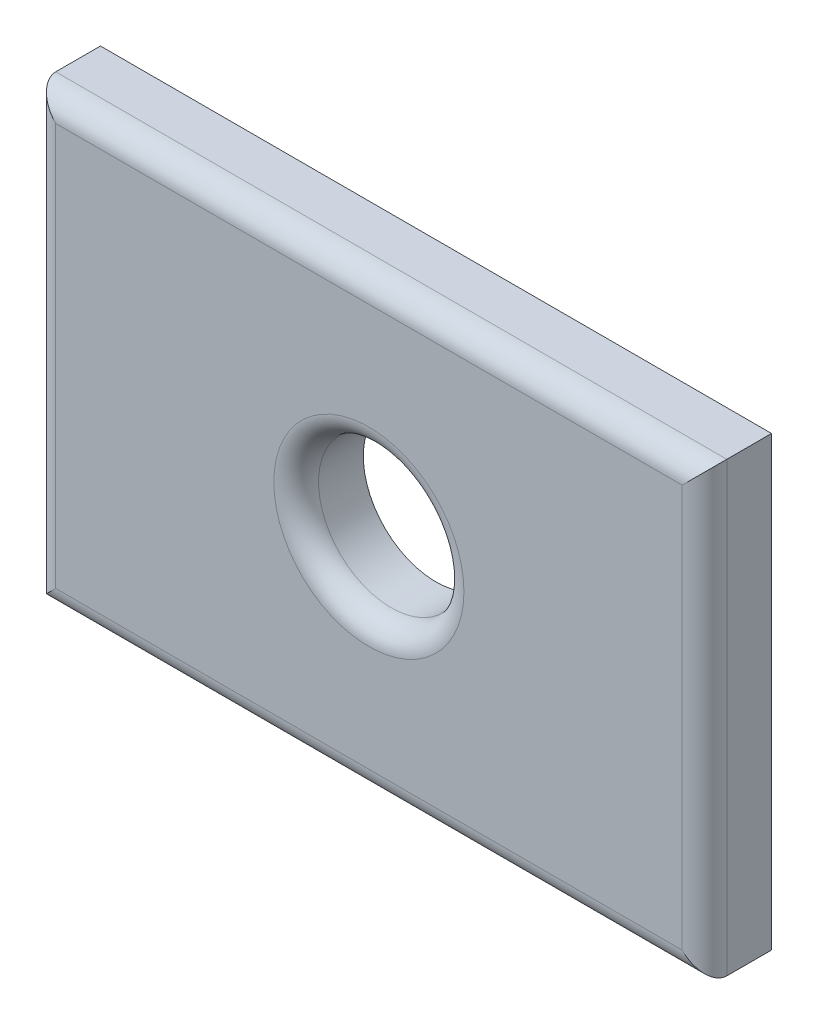
ISO-10303-21;
HEADER;
FILE_DESCRIPTION(('STEP AP214'),'2;1');
FILE_NAME('part.step','',(''),(''),'','','');
FILE_SCHEMA(('AUTOMOTIVE_DESIGN { 1 0 10303 214 1 1 1 1 }'));
ENDSEC;
DATA;
#1=APPLICATION_CONTEXT('core data for automotive mechanical design processes');
#2=APPLICATION_PROTOCOL_DEFINITION('international standard','automotive_design',2000,#1);
#3=PRODUCT_CONTEXT('',#1,'mechanical');
#4=PRODUCT('Part','Part','',(#3));
#5=PRODUCT_RELATED_PRODUCT_CATEGORY('part','',(#4));
#6=PRODUCT_DEFINITION_FORMATION('','',#4);
#7=PRODUCT_DEFINITION_CONTEXT('part definition',#1,'design');
#8=PRODUCT_DEFINITION('design','',#6,#7);
#9=PRODUCT_DEFINITION_SHAPE('','',#8);
#10=(LENGTH_UNIT() NAMED_UNIT(*) SI_UNIT(.MILLI.,.METRE.));
#11=(NAMED_UNIT(*) PLANE_ANGLE_UNIT() SI_UNIT($,.RADIAN.));
#12=(NAMED_UNIT(*) SI_UNIT($,.STERADIAN.) SOLID_ANGLE_UNIT());
#13=UNCERTAINTY_MEASURE_WITH_UNIT(LENGTH_MEASURE(1.E-05),#10,'distance_accuracy_value','');
#14=(GEOMETRIC_REPRESENTATION_CONTEXT(3) GLOBAL_UNCERTAINTY_ASSIGNED_CONTEXT((#13)) GLOBAL_UNIT_ASSIGNED_CONTEXT((#10,
#11,#12)) REPRESENTATION_CONTEXT('',''));
#15=CARTESIAN_POINT('',(0.,0.,0.));
#16=DIRECTION('',(0.,0.,1.));
#17=DIRECTION('',(1.,0.,0.));
#18=AXIS2_PLACEMENT_3D('',#15,#16,#17);
#19=CARTESIAN_POINT('',(-20.0778282304494,9.02612826603326,3.));
#20=DIRECTION('',(1.,0.,0.));
#21=DIRECTION('',(0.,0.,-1.));
#22=AXIS2_PLACEMENT_3D('',#19,#20,#21);
#23=PLANE('',#22);
#24=DIRECTION('',(0.,0.,-1.));
#25=VECTOR('',#24,1.);
#26=CARTESIAN_POINT('',(-20.0778282304494,-10.9738717339667,3.));
#27=LINE('',#26,#25);
#28=CARTESIAN_POINT('',(-20.0778282304494,-10.9738717339667,2.));
#29=VERTEX_POINT('',#28);
#30=CARTESIAN_POINT('',(-20.0778282304494,-10.9738717339667,0.));
#31=VERTEX_POINT('',#30);
#32=EDGE_CURVE('E86',#29,#31,#27,.T.);
#33=ORIENTED_EDGE('',*,*,#32,.F.);
#34=DIRECTION('',(0.,-1.,0.));
#35=VECTOR('',#34,1.);
#36=CARTESIAN_POINT('',(-20.0778282304494,9.02612826603326,2.));
#37=LINE('',#36,#35);
#38=CARTESIAN_POINT('',(-20.0778282304494,9.02612826603326,2.));
#39=VERTEX_POINT('',#38);
#40=EDGE_CURVE('E41',#29,#39,#37,.F.);
#41=ORIENTED_EDGE('',*,*,#40,.T.);
#42=DIRECTION('',(0.,0.,-1.));
#43=VECTOR('',#42,1.);
#44=CARTESIAN_POINT('',(-20.0778282304494,9.02612826603326,3.));
#45=LINE('',#44,#43);
#46=CARTESIAN_POINT('',(-20.0778282304494,9.02612826603326,0.));
#47=VERTEX_POINT('',#46);
#48=EDGE_CURVE('E106',#39,#47,#45,.T.);
#49=ORIENTED_EDGE('',*,*,#48,.T.);
#50=DIRECTION('',(0.,-1.,0.));
#51=VECTOR('',#50,1.);
#52=CARTESIAN_POINT('',(-20.0778282304494,9.02612826603326,0.));
#53=LINE('',#52,#51);
#54=EDGE_CURVE('E101',#47,#31,#53,.T.);
#55=ORIENTED_EDGE('',*,*,#54,.T.);
#56=EDGE_LOOP('',(#33,#41,#49,#55));
#57=FACE_BOUND('',#56,.T.);
#58=ADVANCED_FACE('F32',(#57),#23,.F.);
#59=CARTESIAN_POINT('',(-20.0778282304494,-10.9738717339667,3.));
#60=DIRECTION('',(0.,1.,0.));
#61=DIRECTION('',(0.,0.,1.));
#62=AXIS2_PLACEMENT_3D('',#59,#60,#61);
#63=PLANE('',#62);
#64=DIRECTION('',(0.,0.,-1.));
#65=VECTOR('',#64,1.);
#66=CARTESIAN_POINT('',(9.92217176955057,-10.9738717339667,3.));
#67=LINE('',#66,#65);
#68=CARTESIAN_POINT('',(9.92217176955057,-10.9738717339667,2.));
#69=VERTEX_POINT('',#68);
#70=CARTESIAN_POINT('',(9.92217176955057,-10.9738717339667,0.));
#71=VERTEX_POINT('',#70);
#72=EDGE_CURVE('E95',#69,#71,#67,.T.);
#73=ORIENTED_EDGE('',*,*,#72,.F.);
#74=DIRECTION('',(1.,0.,0.));
#75=VECTOR('',#74,1.);
#76=CARTESIAN_POINT('',(-20.0778282304494,-10.9738717339667,2.));
#77=LINE('',#76,#75);
#78=EDGE_CURVE('E49',#69,#29,#77,.F.);
#79=ORIENTED_EDGE('',*,*,#78,.T.);
#80=ORIENTED_EDGE('',*,*,#32,.T.);
#81=DIRECTION('',(1.,0.,0.));
#82=VECTOR('',#81,1.);
#83=CARTESIAN_POINT('',(-20.0778282304494,-10.9738717339667,0.));
#84=LINE('',#83,#82);
#85=EDGE_CURVE('E89',#31,#71,#84,.T.);
#86=ORIENTED_EDGE('',*,*,#85,.T.);
#87=EDGE_LOOP('',(#73,#79,#80,#86));
#88=FACE_BOUND('',#87,.T.);
#89=ADVANCED_FACE('F88',(#88),#63,.F.);
#90=CARTESIAN_POINT('',(9.92217176955057,9.02612826603326,3.));
#91=DIRECTION('',(-1.,0.,0.));
#92=DIRECTION('',(0.,0.,1.));
#93=AXIS2_PLACEMENT_3D('',#90,#91,#92);
#94=PLANE('',#93);
#95=DIRECTION('',(0.,0.,-1.));
#96=VECTOR('',#95,1.);
#97=CARTESIAN_POINT('',(9.92217176955057,9.02612826603326,3.));
#98=LINE('',#97,#96);
#99=CARTESIAN_POINT('',(9.92217176955057,9.02612826603326,2.));
#100=VERTEX_POINT('',#99);
#101=CARTESIAN_POINT('',(9.92217176955057,9.02612826603326,0.));
#102=VERTEX_POINT('',#101);
#103=EDGE_CURVE('E117',#100,#102,#98,.T.);
#104=ORIENTED_EDGE('',*,*,#103,.F.);
#105=DIRECTION('',(0.,1.,0.));
#106=VECTOR('',#105,1.);
#107=CARTESIAN_POINT('',(9.92217176955057,-10.9738717339667,2.));
#108=LINE('',#107,#106);
#109=EDGE_CURVE('E57',#100,#69,#108,.F.);
#110=ORIENTED_EDGE('',*,*,#109,.T.);
#111=ORIENTED_EDGE('',*,*,#72,.T.);
#112=DIRECTION('',(0.,1.,0.));
#113=VECTOR('',#112,1.);
#114=CARTESIAN_POINT('',(9.92217176955057,9.02612826603326,0.));
#115=LINE('',#114,#113);
#116=EDGE_CURVE('E103',#71,#102,#115,.T.);
#117=ORIENTED_EDGE('',*,*,#116,.T.);
#118=EDGE_LOOP('',(#104,#110,#111,#117));
#119=FACE_BOUND('',#118,.T.);
#120=ADVANCED_FACE('F189',(#119),#94,.F.);
#121=CARTESIAN_POINT('',(-20.0778282304494,9.02612826603326,3.));
#122=DIRECTION('',(0.,-1.,0.));
#123=DIRECTION('',(0.,0.,-1.));
#124=AXIS2_PLACEMENT_3D('',#121,#122,#123);
#125=PLANE('',#124);
#126=ORIENTED_EDGE('',*,*,#48,.F.);
#127=DIRECTION('',(-1.,0.,0.));
#128=VECTOR('',#127,1.);
#129=CARTESIAN_POINT('',(9.92217176955057,9.02612826603326,2.));
#130=LINE('',#129,#128);
#131=EDGE_CURVE('E131',#39,#100,#130,.F.);
#132=ORIENTED_EDGE('',*,*,#131,.T.);
#133=ORIENTED_EDGE('',*,*,#103,.T.);
#134=DIRECTION('',(-1.,0.,0.));
#135=VECTOR('',#134,1.);
#136=CARTESIAN_POINT('',(-20.0778282304494,9.02612826603326,0.));
#137=LINE('',#136,#135);
#138=EDGE_CURVE('E114',#102,#47,#137,.T.);
#139=ORIENTED_EDGE('',*,*,#138,.T.);
#140=EDGE_LOOP('',(#126,#132,#133,#139));
#141=FACE_BOUND('',#140,.T.);
#142=ADVANCED_FACE('F158',(#141),#125,.F.);
#143=CARTESIAN_POINT('',(0.,0.,3.));
#144=DIRECTION('',(0.,0.,1.));
#145=DIRECTION('',(1.,0.,0.));
#146=AXIS2_PLACEMENT_3D('',#143,#144,#145);
#147=PLANE('',#146);
#148=DIRECTION('',(0.,1.,0.));
#149=VECTOR('',#148,1.);
#150=CARTESIAN_POINT('',(8.92217176955057,9.02612826603326,3.));
#151=LINE('',#150,#149);
#152=CARTESIAN_POINT('',(8.92217176955057,-9.97387173396674,3.));
#153=VERTEX_POINT('',#152);
#154=CARTESIAN_POINT('',(8.92217176955057,8.02612826603325,3.));
#155=VERTEX_POINT('',#154);
#156=EDGE_CURVE('E126',#153,#155,#151,.T.);
#157=ORIENTED_EDGE('',*,*,#156,.T.);
#158=DIRECTION('',(-1.,0.,0.));
#159=VECTOR('',#158,1.);
#160=CARTESIAN_POINT('',(-20.0778282304494,8.02612826603325,3.));
#161=LINE('',#160,#159);
#162=CARTESIAN_POINT('',(-19.0778282304494,8.02612826603325,3.));
#163=VERTEX_POINT('',#162);
#164=EDGE_CURVE('E128',#155,#163,#161,.T.);
#165=ORIENTED_EDGE('',*,*,#164,.T.);
#166=DIRECTION('',(0.,-1.,0.));
#167=VECTOR('',#166,1.);
#168=CARTESIAN_POINT('',(-19.0778282304494,-10.9738717339667,3.));
#169=LINE('',#168,#167);
#170=CARTESIAN_POINT('',(-19.0778282304494,-9.97387173396674,3.));
#171=VERTEX_POINT('',#170);
#172=EDGE_CURVE('E122',#163,#171,#169,.T.);
#173=ORIENTED_EDGE('',*,*,#172,.T.);
#174=DIRECTION('',(1.,0.,0.));
#175=VECTOR('',#174,1.);
#176=CARTESIAN_POINT('',(9.92217176955057,-9.97387173396674,3.));
#177=LINE('',#176,#175);
#178=EDGE_CURVE('E124',#171,#153,#177,.T.);
#179=ORIENTED_EDGE('',*,*,#178,.T.);
#180=EDGE_LOOP('',(#157,#165,#173,#179));
#181=FACE_BOUND('',#180,.T.);
#182=CARTESIAN_POINT('',(-5.07782823044943,-0.973871733966748,3.));
#183=DIRECTION('',(0.,0.,1.));
#184=DIRECTION('',(1.,0.,0.));
#185=AXIS2_PLACEMENT_3D('',#182,#183,#184);
#186=CIRCLE('',#185,4.25);
#187=CARTESIAN_POINT('',(-0.827828230449426,-0.973871733966748,3.));
#188=VERTEX_POINT('',#187);
#189=EDGE_CURVE('E94',#188,#188,#186,.F.);
#190=ORIENTED_EDGE('',*,*,#189,.T.);
#191=EDGE_LOOP('',(#190));
#192=FACE_BOUND('',#191,.T.);
#193=ADVANCED_FACE('F163',(#181,#192),#147,.T.);
#194=CARTESIAN_POINT('',(0.,0.,0.));
#195=DIRECTION('',(0.,0.,1.));
#196=DIRECTION('',(1.,0.,0.));
#197=AXIS2_PLACEMENT_3D('',#194,#195,#196);
#198=PLANE('',#197);
#199=CARTESIAN_POINT('',(-5.07782823044943,-0.973871733966748,0.));
#200=DIRECTION('',(0.,0.,1.));
#201=DIRECTION('',(1.,0.,0.));
#202=AXIS2_PLACEMENT_3D('',#199,#200,#201);
#203=CIRCLE('',#202,3.25);
#204=CARTESIAN_POINT('',(-1.82782823044943,-0.973871733966748,0.));
#205=VERTEX_POINT('',#204);
#206=EDGE_CURVE('E108',#205,#205,#203,.T.);
#207=ORIENTED_EDGE('',*,*,#206,.T.);
#208=EDGE_LOOP('',(#207));
#209=FACE_BOUND('',#208,.T.);
#210=ORIENTED_EDGE('',*,*,#54,.F.);
#211=ORIENTED_EDGE('',*,*,#138,.F.);
#212=ORIENTED_EDGE('',*,*,#116,.F.);
#213=ORIENTED_EDGE('',*,*,#85,.F.);
#214=EDGE_LOOP('',(#210,#211,#212,#213));
#215=FACE_BOUND('',#214,.T.);
#216=ADVANCED_FACE('F99',(#209,#215),#198,.F.);
#217=CARTESIAN_POINT('',(-5.07782823044943,-0.973871733966748,0.));
#218=DIRECTION('',(0.,0.,1.));
#219=DIRECTION('',(1.,0.,0.));
#220=AXIS2_PLACEMENT_3D('',#217,#218,#219);
#221=CYLINDRICAL_SURFACE('',#220,3.25);
#222=CARTESIAN_POINT('',(-5.07782823044943,-0.973871733966748,2.));
#223=DIRECTION('',(0.,0.,1.));
#224=DIRECTION('',(1.,0.,0.));
#225=AXIS2_PLACEMENT_3D('',#222,#223,#224);
#226=CIRCLE('',#225,3.25);
#227=CARTESIAN_POINT('',(-1.82782823044943,-0.973871733966748,2.));
#228=VERTEX_POINT('',#227);
#229=EDGE_CURVE('E11',#228,#228,#226,.T.);
#230=ORIENTED_EDGE('',*,*,#229,.T.);
#231=EDGE_LOOP('',(#230));
#232=FACE_BOUND('',#231,.T.);
#233=ORIENTED_EDGE('',*,*,#206,.F.);
#234=EDGE_LOOP('',(#233));
#235=FACE_BOUND('',#234,.T.);
#236=ADVANCED_FACE('F173',(#232,#235),#221,.F.);
#237=CARTESIAN_POINT('',(0.,-9.97387173396674,2.));
#238=DIRECTION('',(-1.,0.,0.));
#239=DIRECTION('',(0.,0.,1.));
#240=AXIS2_PLACEMENT_3D('',#237,#238,#239);
#241=CYLINDRICAL_SURFACE('',#240,1.);
#242=CARTESIAN_POINT('',(-19.0778282304494,-9.97387173396674,2.));
#243=DIRECTION('',(-0.707106781186547,0.707106781186547,0.));
#244=DIRECTION('',(0.707106781186547,0.707106781186547,0.));
#245=AXIS2_PLACEMENT_3D('',#242,#243,#244);
#246=ELLIPSE('',#245,1.41421356237309,1.);
#247=EDGE_CURVE('E140',#29,#171,#246,.T.);
#248=ORIENTED_EDGE('',*,*,#247,.F.);
#249=ORIENTED_EDGE('',*,*,#78,.F.);
#250=CARTESIAN_POINT('',(8.92217176955057,-9.97387173396674,2.));
#251=DIRECTION('',(-0.707106781186547,-0.707106781186547,0.));
#252=DIRECTION('',(-0.707106781186547,0.707106781186547,0.));
#253=AXIS2_PLACEMENT_3D('',#250,#251,#252);
#254=ELLIPSE('',#253,1.41421356237309,1.);
#255=EDGE_CURVE('E36',#153,#69,#254,.F.);
#256=ORIENTED_EDGE('',*,*,#255,.F.);
#257=ORIENTED_EDGE('',*,*,#178,.F.);
#258=EDGE_LOOP('',(#248,#249,#256,#257));
#259=FACE_BOUND('',#258,.T.);
#260=ADVANCED_FACE('F153',(#259),#241,.T.);
#261=CARTESIAN_POINT('',(8.92217176955057,0.,2.));
#262=DIRECTION('',(0.,-1.,0.));
#263=DIRECTION('',(0.,0.,-1.));
#264=AXIS2_PLACEMENT_3D('',#261,#262,#263);
#265=CYLINDRICAL_SURFACE('',#264,1.);
#266=ORIENTED_EDGE('',*,*,#255,.T.);
#267=ORIENTED_EDGE('',*,*,#109,.F.);
#268=CARTESIAN_POINT('',(8.92217176955057,8.02612826603325,2.));
#269=DIRECTION('',(0.707106781186547,-0.707106781186547,0.));
#270=DIRECTION('',(-0.707106781186547,-0.707106781186547,0.));
#271=AXIS2_PLACEMENT_3D('',#268,#269,#270);
#272=ELLIPSE('',#271,1.41421356237309,1.);
#273=EDGE_CURVE('E139',#155,#100,#272,.F.);
#274=ORIENTED_EDGE('',*,*,#273,.F.);
#275=ORIENTED_EDGE('',*,*,#156,.F.);
#276=EDGE_LOOP('',(#266,#267,#274,#275));
#277=FACE_BOUND('',#276,.T.);
#278=ADVANCED_FACE('F149',(#277),#265,.T.);
#279=CARTESIAN_POINT('',(-19.0778282304494,0.,2.));
#280=DIRECTION('',(0.,1.,0.));
#281=DIRECTION('',(0.,0.,1.));
#282=AXIS2_PLACEMENT_3D('',#279,#280,#281);
#283=CYLINDRICAL_SURFACE('',#282,1.);
#284=ORIENTED_EDGE('',*,*,#247,.T.);
#285=ORIENTED_EDGE('',*,*,#172,.F.);
#286=CARTESIAN_POINT('',(-19.0778282304494,8.02612826603325,2.));
#287=DIRECTION('',(0.707106781186547,0.707106781186547,0.));
#288=DIRECTION('',(-0.707106781186547,0.707106781186547,0.));
#289=AXIS2_PLACEMENT_3D('',#286,#287,#288);
#290=ELLIPSE('',#289,1.41421356237309,1.);
#291=EDGE_CURVE('E137',#39,#163,#290,.T.);
#292=ORIENTED_EDGE('',*,*,#291,.F.);
#293=ORIENTED_EDGE('',*,*,#40,.F.);
#294=EDGE_LOOP('',(#284,#285,#292,#293));
#295=FACE_BOUND('',#294,.T.);
#296=ADVANCED_FACE('F155',(#295),#283,.T.);
#297=CARTESIAN_POINT('',(0.,8.02612826603325,2.));
#298=DIRECTION('',(1.,0.,0.));
#299=DIRECTION('',(0.,0.,-1.));
#300=AXIS2_PLACEMENT_3D('',#297,#298,#299);
#301=CYLINDRICAL_SURFACE('',#300,1.);
#302=ORIENTED_EDGE('',*,*,#273,.T.);
#303=ORIENTED_EDGE('',*,*,#131,.F.);
#304=ORIENTED_EDGE('',*,*,#291,.T.);
#305=ORIENTED_EDGE('',*,*,#164,.F.);
#306=EDGE_LOOP('',(#302,#303,#304,#305));
#307=FACE_BOUND('',#306,.T.);
#308=ADVANCED_FACE('F160',(#307),#301,.T.);
#309=CARTESIAN_POINT('',(-5.07782823044943,-0.973871733966748,2.));
#310=DIRECTION('',(0.,0.,1.));
#311=DIRECTION('',(1.,0.,0.));
#312=AXIS2_PLACEMENT_3D('',#309,#310,#311);
#313=TOROIDAL_SURFACE('',#312,4.25,1.);
#314=ORIENTED_EDGE('',*,*,#189,.F.);
#315=EDGE_LOOP('',(#314));
#316=FACE_BOUND('',#315,.T.);
#317=ORIENTED_EDGE('',*,*,#229,.F.);
#318=EDGE_LOOP('',(#317));
#319=FACE_BOUND('',#318,.T.);
#320=ADVANCED_FACE('F34',(#316,#319),#313,.T.);
#321=CLOSED_SHELL('',(#58,#89,#120,#142,#193,#216,#236,#260,#278,#296,#308,#320));
#322=MANIFOLD_SOLID_BREP('B2',#321);
#323=ADVANCED_BREP_SHAPE_REPRESENTATION('',(#18,#322),#14);
#324=SHAPE_DEFINITION_REPRESENTATION(#9,#323);
ENDSEC;
END-ISO-10303-21;
